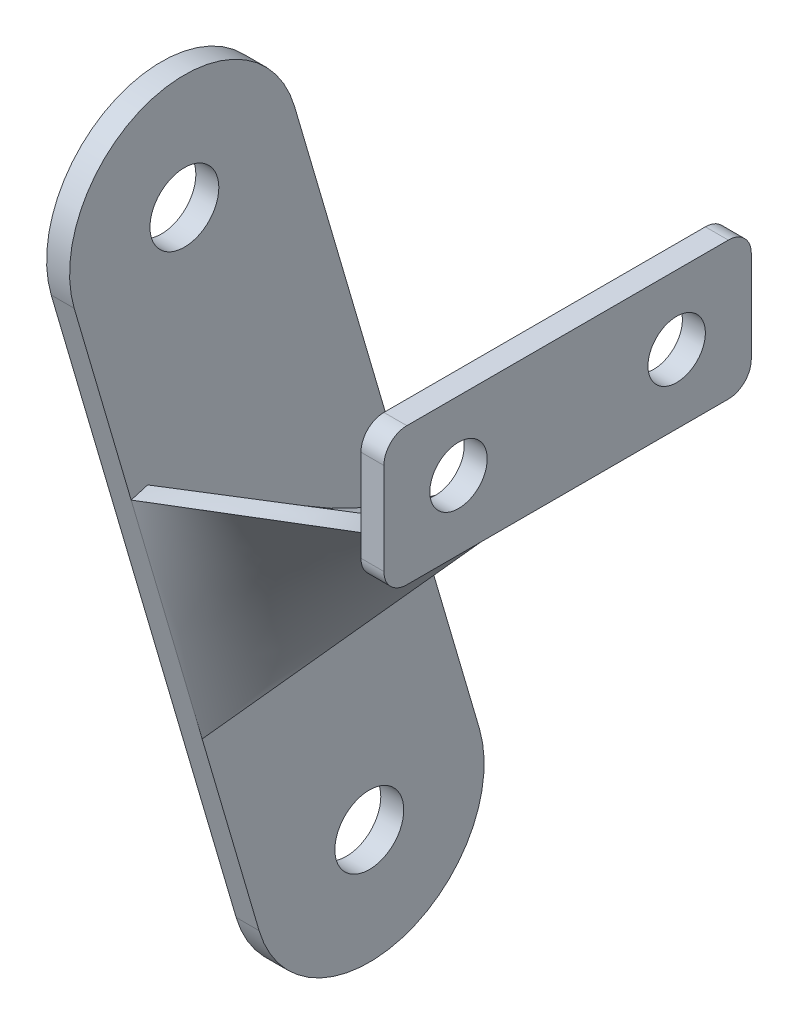
ISO-10303-21;
HEADER;
FILE_DESCRIPTION(('STEP AP214'),'2;1');
FILE_NAME('part.step','',(''),(''),'','','');
FILE_SCHEMA(('AUTOMOTIVE_DESIGN { 1 0 10303 214 1 1 1 1 }'));
ENDSEC;
DATA;
#1=APPLICATION_CONTEXT('core data for automotive mechanical design processes');
#2=APPLICATION_PROTOCOL_DEFINITION('international standard','automotive_design',2000,#1);
#3=PRODUCT_CONTEXT('',#1,'mechanical');
#4=PRODUCT('Part','Part','',(#3));
#5=PRODUCT_RELATED_PRODUCT_CATEGORY('part','',(#4));
#6=PRODUCT_DEFINITION_FORMATION('','',#4);
#7=PRODUCT_DEFINITION_CONTEXT('part definition',#1,'design');
#8=PRODUCT_DEFINITION('design','',#6,#7);
#9=PRODUCT_DEFINITION_SHAPE('','',#8);
#10=(LENGTH_UNIT() NAMED_UNIT(*) SI_UNIT(.MILLI.,.METRE.));
#11=(NAMED_UNIT(*) PLANE_ANGLE_UNIT() SI_UNIT($,.RADIAN.));
#12=(NAMED_UNIT(*) SI_UNIT($,.STERADIAN.) SOLID_ANGLE_UNIT());
#13=UNCERTAINTY_MEASURE_WITH_UNIT(LENGTH_MEASURE(1.E-05),#10,'distance_accuracy_value','');
#14=(GEOMETRIC_REPRESENTATION_CONTEXT(3) GLOBAL_UNCERTAINTY_ASSIGNED_CONTEXT((#13)) GLOBAL_UNIT_ASSIGNED_CONTEXT((#10,
#11,#12)) REPRESENTATION_CONTEXT('',''));
#15=CARTESIAN_POINT('',(0.,0.,0.));
#16=DIRECTION('',(0.,0.,1.));
#17=DIRECTION('',(1.,0.,0.));
#18=AXIS2_PLACEMENT_3D('',#15,#16,#17);
#19=CARTESIAN_POINT('',(-71.4,-55.,-16.1070202085923));
#20=DIRECTION('',(-1.,0.,0.));
#21=DIRECTION('',(0.,0.,-1.));
#22=AXIS2_PLACEMENT_3D('',#19,#20,#21);
#23=PLANE('',#22);
#24=CARTESIAN_POINT('',(-71.4,0.,0.));
#25=DIRECTION('',(1.,0.,0.));
#26=DIRECTION('',(0.,0.,-1.));
#27=AXIS2_PLACEMENT_3D('',#24,#25,#26);
#28=CIRCLE('',#27,3.);
#29=CARTESIAN_POINT('',(-71.4,0.,-3.));
#30=VERTEX_POINT('',#29);
#31=EDGE_CURVE('E233',#30,#30,#28,.T.);
#32=ORIENTED_EDGE('',*,*,#31,.F.);
#33=EDGE_LOOP('',(#32));
#34=FACE_BOUND('',#33,.T.);
#35=CARTESIAN_POINT('',(-71.4,-55.,-16.1070202085923));
#36=DIRECTION('',(1.,0.,0.));
#37=DIRECTION('',(0.,0.,-1.));
#38=AXIS2_PLACEMENT_3D('',#35,#36,#37);
#39=CIRCLE('',#38,3.);
#40=CARTESIAN_POINT('',(-71.4,-55.,-19.1070202085923));
#41=VERTEX_POINT('',#40);
#42=EDGE_CURVE('E223',#41,#41,#39,.T.);
#43=ORIENTED_EDGE('',*,*,#42,.F.);
#44=EDGE_LOOP('',(#43));
#45=FACE_BOUND('',#44,.T.);
#46=DIRECTION('',(0.,0.281050780118523,-0.959692898272551));
#47=VECTOR('',#46,1.);
#48=CARTESIAN_POINT('',(-71.4,-19.5430978350982,3.91520778602865));
#49=LINE('',#48,#47);
#50=CARTESIAN_POINT('',(-71.4,-19.7538859201871,4.63497745973307));
#51=VERTEX_POINT('',#50);
#52=CARTESIAN_POINT('',(-71.4,-19.3323097500093,3.19543811232423));
#53=VERTEX_POINT('',#52);
#54=EDGE_CURVE('E209',#51,#53,#49,.T.);
#55=ORIENTED_EDGE('',*,*,#54,.T.);
#56=DIRECTION('',(0.,-0.959692898272553,-0.281050780118519));
#57=VECTOR('',#56,1.);
#58=CARTESIAN_POINT('',(-71.4,-29.8889316310074,0.103879531020527));
#59=LINE('',#58,#57);
#60=CARTESIAN_POINT('',(-71.4,-40.4455535120055,-2.98767905028318));
#61=VERTEX_POINT('',#60);
#62=EDGE_CURVE('E191',#53,#61,#59,.T.);
#63=ORIENTED_EDGE('',*,*,#62,.T.);
#64=DIRECTION('',(0.,-0.281050780118521,0.959692898272552));
#65=VECTOR('',#64,1.);
#66=CARTESIAN_POINT('',(-71.4,-40.6563415970944,-2.26790937657876));
#67=LINE('',#66,#65);
#68=CARTESIAN_POINT('',(-71.4,-40.8671296821833,-1.54813970287435));
#69=VERTEX_POINT('',#68);
#70=EDGE_CURVE('E199',#61,#69,#67,.T.);
#71=ORIENTED_EDGE('',*,*,#70,.T.);
#72=DIRECTION('',(0.,-0.959692898272552,-0.281050780118519));
#73=VECTOR('',#72,1.);
#74=CARTESIAN_POINT('',(-71.4,-57.8105078011852,-6.51009122586681));
#75=LINE('',#74,#73);
#76=CARTESIAN_POINT('',(-71.4,-57.8105078011852,-6.51009122586681));
#77=VERTEX_POINT('',#76);
#78=EDGE_CURVE('E250',#69,#77,#75,.T.);
#79=ORIENTED_EDGE('',*,*,#78,.T.);
#80=CARTESIAN_POINT('',(-71.4,-55.,-16.1070202085923));
#81=DIRECTION('',(1.,0.,0.));
#82=DIRECTION('',(0.,0.,-1.));
#83=AXIS2_PLACEMENT_3D('',#80,#81,#82);
#84=CIRCLE('',#83,10.);
#85=CARTESIAN_POINT('',(-71.4,-52.1894921988148,-25.7039491913179));
#86=VERTEX_POINT('',#85);
#87=EDGE_CURVE('E240',#77,#86,#84,.T.);
#88=ORIENTED_EDGE('',*,*,#87,.T.);
#89=DIRECTION('',(0.,0.959692898272552,0.281050780118519));
#90=VECTOR('',#89,1.);
#91=CARTESIAN_POINT('',(-71.4,-52.1894921988148,-25.7039491913179));
#92=LINE('',#91,#90);
#93=CARTESIAN_POINT('',(-71.4,2.81050780118519,-9.59692898272552));
#94=VERTEX_POINT('',#93);
#95=EDGE_CURVE('E238',#86,#94,#92,.T.);
#96=ORIENTED_EDGE('',*,*,#95,.T.);
#97=CARTESIAN_POINT('',(-71.4,0.,0.));
#98=DIRECTION('',(1.,0.,0.));
#99=DIRECTION('',(0.,0.,-1.));
#100=AXIS2_PLACEMENT_3D('',#97,#98,#99);
#101=CIRCLE('',#100,10.);
#102=CARTESIAN_POINT('',(-71.4,-2.81050780118519,9.59692898272552));
#103=VERTEX_POINT('',#102);
#104=EDGE_CURVE('E243',#94,#103,#101,.T.);
#105=ORIENTED_EDGE('',*,*,#104,.T.);
#106=EDGE_CURVE('E246',#103,#51,#75,.T.);
#107=ORIENTED_EDGE('',*,*,#106,.T.);
#108=EDGE_LOOP('',(#55,#63,#71,#79,#88,#96,#105,#107));
#109=FACE_BOUND('',#108,.T.);
#110=ADVANCED_FACE('F43',(#34,#45,#109),#23,.F.);
#111=CARTESIAN_POINT('',(-71.4,-55.,-16.1070202085923));
#112=DIRECTION('',(-1.,0.,0.));
#113=DIRECTION('',(0.,0.,-1.));
#114=AXIS2_PLACEMENT_3D('',#111,#112,#113);
#115=CYLINDRICAL_SURFACE('',#114,10.);
#116=CARTESIAN_POINT('',(-73.4,-55.,-16.1070202085923));
#117=DIRECTION('',(1.,0.,0.));
#118=DIRECTION('',(0.,0.,-1.));
#119=AXIS2_PLACEMENT_3D('',#116,#117,#118);
#120=CIRCLE('',#119,10.);
#121=CARTESIAN_POINT('',(-73.4,-57.8105078011852,-6.51009122586681));
#122=VERTEX_POINT('',#121);
#123=CARTESIAN_POINT('',(-73.4,-52.1894921988148,-25.7039491913179));
#124=VERTEX_POINT('',#123);
#125=EDGE_CURVE('E232',#122,#124,#120,.T.);
#126=ORIENTED_EDGE('',*,*,#125,.T.);
#127=DIRECTION('',(-1.,0.,0.));
#128=VECTOR('',#127,1.);
#129=CARTESIAN_POINT('',(-71.4,-52.1894921988148,-25.7039491913179));
#130=LINE('',#129,#128);
#131=EDGE_CURVE('E50',#86,#124,#130,.T.);
#132=ORIENTED_EDGE('',*,*,#131,.F.);
#133=ORIENTED_EDGE('',*,*,#87,.F.);
#134=DIRECTION('',(-1.,0.,0.));
#135=VECTOR('',#134,1.);
#136=CARTESIAN_POINT('',(-71.4,-57.8105078011852,-6.51009122586681));
#137=LINE('',#136,#135);
#138=EDGE_CURVE('E11',#77,#122,#137,.T.);
#139=ORIENTED_EDGE('',*,*,#138,.T.);
#140=EDGE_LOOP('',(#126,#132,#133,#139));
#141=FACE_BOUND('',#140,.T.);
#142=ADVANCED_FACE('F44',(#141),#115,.T.);
#143=CARTESIAN_POINT('',(-71.4,-57.8105078011852,-6.51009122586681));
#144=DIRECTION('',(0.,-0.281050780118519,0.959692898272553));
#145=DIRECTION('',(0.,-0.959692898272553,-0.281050780118519));
#146=AXIS2_PLACEMENT_3D('',#143,#144,#145);
#147=PLANE('',#146);
#148=DIRECTION('',(0.,-0.959692898272552,-0.281050780118519));
#149=VECTOR('',#148,1.);
#150=CARTESIAN_POINT('',(-73.4,-57.8105078011852,-6.51009122586681));
#151=LINE('',#150,#149);
#152=CARTESIAN_POINT('',(-73.4,-2.81050780118519,9.59692898272552));
#153=VERTEX_POINT('',#152);
#154=EDGE_CURVE('E244',#153,#122,#151,.T.);
#155=ORIENTED_EDGE('',*,*,#154,.T.);
#156=ORIENTED_EDGE('',*,*,#138,.F.);
#157=ORIENTED_EDGE('',*,*,#78,.F.);
#158=DIRECTION('',(0.,0.959692898272553,0.281050780118519));
#159=VECTOR('',#158,1.);
#160=CARTESIAN_POINT('',(-71.4,-30.3105078011852,1.54341887842936));
#161=LINE('',#160,#159);
#162=EDGE_CURVE('E204',#69,#51,#161,.T.);
#163=ORIENTED_EDGE('',*,*,#162,.T.);
#164=ORIENTED_EDGE('',*,*,#106,.F.);
#165=DIRECTION('',(-1.,0.,0.));
#166=VECTOR('',#165,1.);
#167=CARTESIAN_POINT('',(-71.4,-2.81050780118519,9.59692898272552));
#168=LINE('',#167,#166);
#169=EDGE_CURVE('E55',#103,#153,#168,.T.);
#170=ORIENTED_EDGE('',*,*,#169,.T.);
#171=EDGE_LOOP('',(#155,#156,#157,#163,#164,#170));
#172=FACE_BOUND('',#171,.T.);
#173=ADVANCED_FACE('F280',(#172),#147,.T.);
#174=CARTESIAN_POINT('',(-71.4,0.,0.));
#175=DIRECTION('',(-1.,0.,0.));
#176=DIRECTION('',(0.,0.,-1.));
#177=AXIS2_PLACEMENT_3D('',#174,#175,#176);
#178=CYLINDRICAL_SURFACE('',#177,10.);
#179=CARTESIAN_POINT('',(-73.4,0.,0.));
#180=DIRECTION('',(1.,0.,0.));
#181=DIRECTION('',(0.,0.,-1.));
#182=AXIS2_PLACEMENT_3D('',#179,#180,#181);
#183=CIRCLE('',#182,10.);
#184=CARTESIAN_POINT('',(-73.4,2.81050780118519,-9.59692898272552));
#185=VERTEX_POINT('',#184);
#186=EDGE_CURVE('E254',#185,#153,#183,.T.);
#187=ORIENTED_EDGE('',*,*,#186,.T.);
#188=ORIENTED_EDGE('',*,*,#169,.F.);
#189=ORIENTED_EDGE('',*,*,#104,.F.);
#190=DIRECTION('',(-1.,0.,0.));
#191=VECTOR('',#190,1.);
#192=CARTESIAN_POINT('',(-71.4,2.81050780118519,-9.59692898272552));
#193=LINE('',#192,#191);
#194=EDGE_CURVE('E259',#94,#185,#193,.T.);
#195=ORIENTED_EDGE('',*,*,#194,.T.);
#196=EDGE_LOOP('',(#187,#188,#189,#195));
#197=FACE_BOUND('',#196,.T.);
#198=ADVANCED_FACE('F273',(#197),#178,.T.);
#199=CARTESIAN_POINT('',(-71.4,-52.1894921988148,-25.7039491913179));
#200=DIRECTION('',(0.,0.281050780118519,-0.959692898272553));
#201=DIRECTION('',(0.,0.959692898272553,0.281050780118519));
#202=AXIS2_PLACEMENT_3D('',#199,#200,#201);
#203=PLANE('',#202);
#204=DIRECTION('',(0.,0.959692898272552,0.281050780118519));
#205=VECTOR('',#204,1.);
#206=CARTESIAN_POINT('',(-73.4,-52.1894921988148,-25.7039491913179));
#207=LINE('',#206,#205);
#208=EDGE_CURVE('E251',#124,#185,#207,.T.);
#209=ORIENTED_EDGE('',*,*,#208,.T.);
#210=ORIENTED_EDGE('',*,*,#194,.F.);
#211=ORIENTED_EDGE('',*,*,#95,.F.);
#212=ORIENTED_EDGE('',*,*,#131,.T.);
#213=EDGE_LOOP('',(#209,#210,#211,#212));
#214=FACE_BOUND('',#213,.T.);
#215=ADVANCED_FACE('F270',(#214),#203,.T.);
#216=CARTESIAN_POINT('',(-73.4,-55.,-16.1070202085923));
#217=DIRECTION('',(-1.,0.,0.));
#218=DIRECTION('',(0.,0.,-1.));
#219=AXIS2_PLACEMENT_3D('',#216,#217,#218);
#220=PLANE('',#219);
#221=CARTESIAN_POINT('',(-73.4,-55.,-16.1070202085923));
#222=DIRECTION('',(1.,0.,0.));
#223=DIRECTION('',(0.,0.,-1.));
#224=AXIS2_PLACEMENT_3D('',#221,#222,#223);
#225=CIRCLE('',#224,3.);
#226=CARTESIAN_POINT('',(-73.4,-55.,-19.1070202085923));
#227=VERTEX_POINT('',#226);
#228=EDGE_CURVE('E198',#227,#227,#225,.T.);
#229=ORIENTED_EDGE('',*,*,#228,.T.);
#230=EDGE_LOOP('',(#229));
#231=FACE_BOUND('',#230,.T.);
#232=CARTESIAN_POINT('',(-73.4,0.,0.));
#233=DIRECTION('',(1.,0.,0.));
#234=DIRECTION('',(0.,0.,-1.));
#235=AXIS2_PLACEMENT_3D('',#232,#233,#234);
#236=CIRCLE('',#235,3.);
#237=CARTESIAN_POINT('',(-73.4,0.,-3.));
#238=VERTEX_POINT('',#237);
#239=EDGE_CURVE('E230',#238,#238,#236,.T.);
#240=ORIENTED_EDGE('',*,*,#239,.T.);
#241=EDGE_LOOP('',(#240));
#242=FACE_BOUND('',#241,.T.);
#243=ORIENTED_EDGE('',*,*,#125,.F.);
#244=ORIENTED_EDGE('',*,*,#154,.F.);
#245=ORIENTED_EDGE('',*,*,#186,.F.);
#246=ORIENTED_EDGE('',*,*,#208,.F.);
#247=EDGE_LOOP('',(#243,#244,#245,#246));
#248=FACE_BOUND('',#247,.T.);
#249=ADVANCED_FACE('F272',(#231,#242,#248),#220,.T.);
#250=CARTESIAN_POINT('',(-71.4,0.,0.));
#251=DIRECTION('',(-1.,0.,0.));
#252=DIRECTION('',(0.,0.,-1.));
#253=AXIS2_PLACEMENT_3D('',#250,#251,#252);
#254=CYLINDRICAL_SURFACE('',#253,3.);
#255=ORIENTED_EDGE('',*,*,#31,.T.);
#256=EDGE_LOOP('',(#255));
#257=FACE_BOUND('',#256,.T.);
#258=ORIENTED_EDGE('',*,*,#239,.F.);
#259=EDGE_LOOP('',(#258));
#260=FACE_BOUND('',#259,.T.);
#261=ADVANCED_FACE('F319',(#257,#260),#254,.F.);
#262=CARTESIAN_POINT('',(-71.4,-55.,-16.1070202085923));
#263=DIRECTION('',(-1.,0.,0.));
#264=DIRECTION('',(0.,0.,-1.));
#265=AXIS2_PLACEMENT_3D('',#262,#263,#264);
#266=CYLINDRICAL_SURFACE('',#265,3.);
#267=ORIENTED_EDGE('',*,*,#42,.T.);
#268=EDGE_LOOP('',(#267));
#269=FACE_BOUND('',#268,.T.);
#270=ORIENTED_EDGE('',*,*,#228,.F.);
#271=EDGE_LOOP('',(#270));
#272=FACE_BOUND('',#271,.T.);
#273=ADVANCED_FACE('F342',(#269,#272),#266,.F.);
#274=CARTESIAN_POINT('',(-71.4,-19.3323097500093,3.19543811232423));
#275=CARTESIAN_POINT('',(-38.7,-1.94999999999999,11.));
#276=CARTESIAN_POINT('',(-71.4,-40.4455535120055,-2.98767905028318));
#277=CARTESIAN_POINT('',(-38.7,-1.94999999999999,-11.));
#278=B_SPLINE_SURFACE_WITH_KNOTS('',1,1,((#274,#275),(#276,#277)),.UNSPECIFIED.,.F.,.F.,.F.,(2,
2),(2,2),(0.,1.),(0.,1.),.UNSPECIFIED.);
#279=DIRECTION('',(0.864020011568549,0.459286344687803,0.206217053592571));
#280=VECTOR('',#279,1.);
#281=CARTESIAN_POINT('',(-55.05,-10.6411548750047,7.09771905616212));
#282=LINE('',#281,#280);
#283=CARTESIAN_POINT('',(-38.7,-1.94999999999999,11.));
#284=VERTEX_POINT('',#283);
#285=EDGE_CURVE('E58',#53,#284,#282,.T.);
#286=DIRECTION('',(0.,0.,-1.));
#287=VECTOR('',#286,1.);
#288=CARTESIAN_POINT('',(-38.7,-1.94999999999999,0.));
#289=LINE('',#288,#287);
#290=CARTESIAN_POINT('',(-38.7,-1.94999999999999,-11.));
#291=VERTEX_POINT('',#290);
#292=EDGE_CURVE('E212',#284,#291,#289,.T.);
#293=DIRECTION('',(0.639409543640034,0.752734688173759,-0.156671390885502));
#294=VECTOR('',#293,1.);
#295=CARTESIAN_POINT('',(-55.05,-21.1977767560027,-6.99383952514159));
#296=LINE('',#295,#294);
#297=EDGE_CURVE('E197',#61,#291,#296,.T.);
#298=ORIENTED_EDGE('',*,*,#62,.F.);
#299=ORIENTED_EDGE('',*,*,#285,.T.);
#300=ORIENTED_EDGE('',*,*,#292,.T.);
#301=ORIENTED_EDGE('',*,*,#297,.F.);
#302=EDGE_LOOP('',(#298,#299,#300,#301));
#303=FACE_BOUND('',#302,.T.);
#304=ADVANCED_FACE('F283',(#303),#278,.F.);
#305=CARTESIAN_POINT('',(-71.4,-40.4455535120055,-2.98767905028318));
#306=CARTESIAN_POINT('',(-38.7,-1.94999999999999,-11.));
#307=CARTESIAN_POINT('',(-71.4,-40.8671296821833,-1.54813970287435));
#308=CARTESIAN_POINT('',(-38.7,-3.44999999999999,-11.));
#309=B_SPLINE_SURFACE_WITH_KNOTS('',1,1,((#305,#306),(#307,#308)),.UNSPECIFIED.,.F.,.F.,.F.,(2,
2),(2,2),(0.,1.),(0.,1.),.UNSPECIFIED.);
#310=DIRECTION('',(0.,-1.,0.));
#311=VECTOR('',#310,1.);
#312=CARTESIAN_POINT('',(-38.7,-2.69999999999999,-11.));
#313=LINE('',#312,#311);
#314=CARTESIAN_POINT('',(-38.7,-3.44999999999999,-11.));
#315=VERTEX_POINT('',#314);
#316=EDGE_CURVE('E220',#291,#315,#313,.T.);
#317=DIRECTION('',(0.646458540191,0.739713242583533,-0.186857364213123));
#318=VECTOR('',#317,1.);
#319=CARTESIAN_POINT('',(-55.05,-22.1585648410916,-6.27406985143717));
#320=LINE('',#319,#318);
#321=EDGE_CURVE('E66',#69,#315,#320,.T.);
#322=ORIENTED_EDGE('',*,*,#70,.F.);
#323=ORIENTED_EDGE('',*,*,#297,.T.);
#324=ORIENTED_EDGE('',*,*,#316,.T.);
#325=ORIENTED_EDGE('',*,*,#321,.F.);
#326=EDGE_LOOP('',(#322,#323,#324,#325));
#327=FACE_BOUND('',#326,.T.);
#328=ADVANCED_FACE('F284',(#327),#309,.F.);
#329=CARTESIAN_POINT('',(-71.4,-40.8671296821833,-1.54813970287435));
#330=CARTESIAN_POINT('',(-38.7,-3.44999999999999,-11.));
#331=CARTESIAN_POINT('',(-71.4,-19.7538859201871,4.63497745973306));
#332=CARTESIAN_POINT('',(-38.7,-3.44999999999999,11.));
#333=B_SPLINE_SURFACE_WITH_KNOTS('',1,1,((#329,#330),(#331,#332)),.UNSPECIFIED.,.F.,.F.,.F.,(2,
2),(2,2),(0.,1.),(0.,1.),.UNSPECIFIED.);
#334=DIRECTION('',(0.,0.,1.));
#335=VECTOR('',#334,1.);
#336=CARTESIAN_POINT('',(-38.7,-3.44999999999999,0.));
#337=LINE('',#336,#335);
#338=CARTESIAN_POINT('',(-38.7,-3.44999999999999,11.));
#339=VERTEX_POINT('',#338);
#340=EDGE_CURVE('E218',#315,#339,#337,.T.);
#341=DIRECTION('',(0.881654602784452,0.439583977516991,0.171613193255448));
#342=VECTOR('',#341,1.);
#343=CARTESIAN_POINT('',(-55.05,-11.6019429600936,7.81748872986653));
#344=LINE('',#343,#342);
#345=EDGE_CURVE('E210',#51,#339,#344,.T.);
#346=ORIENTED_EDGE('',*,*,#162,.F.);
#347=ORIENTED_EDGE('',*,*,#321,.T.);
#348=ORIENTED_EDGE('',*,*,#340,.T.);
#349=ORIENTED_EDGE('',*,*,#345,.F.);
#350=EDGE_LOOP('',(#346,#347,#348,#349));
#351=FACE_BOUND('',#350,.T.);
#352=ADVANCED_FACE('F296',(#351),#333,.F.);
#353=CARTESIAN_POINT('',(-71.4,-19.7538859201871,4.63497745973306));
#354=CARTESIAN_POINT('',(-38.7,-3.44999999999999,11.));
#355=CARTESIAN_POINT('',(-71.4,-19.3323097500093,3.19543811232423));
#356=CARTESIAN_POINT('',(-38.7,-1.94999999999999,11.));
#357=B_SPLINE_SURFACE_WITH_KNOTS('',1,1,((#353,#354),(#355,#356)),.UNSPECIFIED.,.F.,.F.,.F.,(2,
2),(2,2),(0.,1.),(0.,1.),.UNSPECIFIED.);
#358=DIRECTION('',(0.,1.,0.));
#359=VECTOR('',#358,1.);
#360=CARTESIAN_POINT('',(-38.7,-2.69999999999999,11.));
#361=LINE('',#360,#359);
#362=EDGE_CURVE('E225',#339,#284,#361,.T.);
#363=ORIENTED_EDGE('',*,*,#54,.F.);
#364=ORIENTED_EDGE('',*,*,#345,.T.);
#365=ORIENTED_EDGE('',*,*,#362,.T.);
#366=ORIENTED_EDGE('',*,*,#285,.F.);
#367=EDGE_LOOP('',(#363,#364,#365,#366));
#368=FACE_BOUND('',#367,.T.);
#369=ADVANCED_FACE('F300',(#368),#357,.F.);
#370=CARTESIAN_POINT('',(-36.7,-1.44999999999999,-12.6770202085923));
#371=DIRECTION('',(-1.,0.,0.));
#372=DIRECTION('',(0.,0.,-1.));
#373=AXIS2_PLACEMENT_3D('',#370,#371,#372);
#374=CYLINDRICAL_SURFACE('',#373,2.);
#375=CARTESIAN_POINT('',(-38.7,-1.44999999999999,-12.6770202085923));
#376=DIRECTION('',(1.,0.,0.));
#377=DIRECTION('',(0.,0.,-1.));
#378=AXIS2_PLACEMENT_3D('',#375,#376,#377);
#379=CIRCLE('',#378,2.);
#380=CARTESIAN_POINT('',(-38.7,-3.44999999999999,-12.6770202085923));
#381=VERTEX_POINT('',#380);
#382=CARTESIAN_POINT('',(-38.7,-1.44999999999999,-14.6770202085923));
#383=VERTEX_POINT('',#382);
#384=EDGE_CURVE('E183',#381,#383,#379,.T.);
#385=ORIENTED_EDGE('',*,*,#384,.T.);
#386=DIRECTION('',(-1.,0.,0.));
#387=VECTOR('',#386,1.);
#388=CARTESIAN_POINT('',(-36.7,-1.44999999999999,-14.6770202085923));
#389=LINE('',#388,#387);
#390=CARTESIAN_POINT('',(-36.7,-1.44999999999999,-14.6770202085923));
#391=VERTEX_POINT('',#390);
#392=EDGE_CURVE('E164',#391,#383,#389,.T.);
#393=ORIENTED_EDGE('',*,*,#392,.F.);
#394=CARTESIAN_POINT('',(-36.7,-1.44999999999999,-12.6770202085923));
#395=DIRECTION('',(1.,0.,0.));
#396=DIRECTION('',(0.,0.,-1.));
#397=AXIS2_PLACEMENT_3D('',#394,#395,#396);
#398=CIRCLE('',#397,2.);
#399=CARTESIAN_POINT('',(-36.7,-3.44999999999999,-12.6770202085923));
#400=VERTEX_POINT('',#399);
#401=EDGE_CURVE('E171',#400,#391,#398,.T.);
#402=ORIENTED_EDGE('',*,*,#401,.F.);
#403=DIRECTION('',(-1.,0.,0.));
#404=VECTOR('',#403,1.);
#405=CARTESIAN_POINT('',(-36.7,-3.44999999999999,-12.6770202085923));
#406=LINE('',#405,#404);
#407=EDGE_CURVE('E221',#400,#381,#406,.T.);
#408=ORIENTED_EDGE('',*,*,#407,.T.);
#409=EDGE_LOOP('',(#385,#393,#402,#408));
#410=FACE_BOUND('',#409,.T.);
#411=ADVANCED_FACE('F181',(#410),#374,.T.);
#412=CARTESIAN_POINT('',(-36.7,-3.44999999999999,15.3229797914077));
#413=DIRECTION('',(0.,-1.,0.));
#414=DIRECTION('',(0.,0.,-1.));
#415=AXIS2_PLACEMENT_3D('',#412,#413,#414);
#416=PLANE('',#415);
#417=DIRECTION('',(0.,0.,-1.));
#418=VECTOR('',#417,1.);
#419=CARTESIAN_POINT('',(-38.7,-3.44999999999999,15.3229797914077));
#420=LINE('',#419,#418);
#421=CARTESIAN_POINT('',(-38.7,-3.44999999999999,15.3229797914077));
#422=VERTEX_POINT('',#421);
#423=EDGE_CURVE('E182',#422,#339,#420,.T.);
#424=ORIENTED_EDGE('',*,*,#423,.T.);
#425=ORIENTED_EDGE('',*,*,#340,.F.);
#426=EDGE_CURVE('E287',#315,#381,#420,.T.);
#427=ORIENTED_EDGE('',*,*,#426,.T.);
#428=ORIENTED_EDGE('',*,*,#407,.F.);
#429=DIRECTION('',(0.,0.,-1.));
#430=VECTOR('',#429,1.);
#431=CARTESIAN_POINT('',(-36.7,-3.44999999999999,15.3229797914077));
#432=LINE('',#431,#430);
#433=CARTESIAN_POINT('',(-36.7,-3.44999999999999,15.3229797914077));
#434=VERTEX_POINT('',#433);
#435=EDGE_CURVE('E180',#434,#400,#432,.T.);
#436=ORIENTED_EDGE('',*,*,#435,.F.);
#437=DIRECTION('',(-1.,0.,0.));
#438=VECTOR('',#437,1.);
#439=CARTESIAN_POINT('',(-36.7,-3.44999999999999,15.3229797914077));
#440=LINE('',#439,#438);
#441=EDGE_CURVE('E550',#434,#422,#440,.T.);
#442=ORIENTED_EDGE('',*,*,#441,.T.);
#443=EDGE_LOOP('',(#424,#425,#427,#428,#436,#442));
#444=FACE_BOUND('',#443,.T.);
#445=ADVANCED_FACE('F294',(#444),#416,.T.);
#446=CARTESIAN_POINT('',(-36.7,-1.44999999999999,15.3229797914077));
#447=DIRECTION('',(-1.,0.,0.));
#448=DIRECTION('',(0.,0.,-1.));
#449=AXIS2_PLACEMENT_3D('',#446,#447,#448);
#450=CYLINDRICAL_SURFACE('',#449,2.);
#451=CARTESIAN_POINT('',(-38.7,-1.44999999999999,15.3229797914077));
#452=DIRECTION('',(1.,0.,0.));
#453=DIRECTION('',(0.,0.,-1.));
#454=AXIS2_PLACEMENT_3D('',#451,#452,#453);
#455=CIRCLE('',#454,2.);
#456=CARTESIAN_POINT('',(-38.7,-1.44999999999999,17.3229797914077));
#457=VERTEX_POINT('',#456);
#458=EDGE_CURVE('E295',#457,#422,#455,.T.);
#459=ORIENTED_EDGE('',*,*,#458,.T.);
#460=ORIENTED_EDGE('',*,*,#441,.F.);
#461=CARTESIAN_POINT('',(-36.7,-1.44999999999999,15.3229797914077));
#462=DIRECTION('',(1.,0.,0.));
#463=DIRECTION('',(0.,0.,-1.));
#464=AXIS2_PLACEMENT_3D('',#461,#462,#463);
#465=CIRCLE('',#464,2.);
#466=CARTESIAN_POINT('',(-36.7,-1.44999999999999,17.3229797914077));
#467=VERTEX_POINT('',#466);
#468=EDGE_CURVE('E188',#467,#434,#465,.T.);
#469=ORIENTED_EDGE('',*,*,#468,.F.);
#470=DIRECTION('',(-1.,0.,0.));
#471=VECTOR('',#470,1.);
#472=CARTESIAN_POINT('',(-36.7,-1.44999999999999,17.3229797914077));
#473=LINE('',#472,#471);
#474=EDGE_CURVE('E548',#467,#457,#473,.T.);
#475=ORIENTED_EDGE('',*,*,#474,.T.);
#476=EDGE_LOOP('',(#459,#460,#469,#475));
#477=FACE_BOUND('',#476,.T.);
#478=ADVANCED_FACE('F391',(#477),#450,.T.);
#479=CARTESIAN_POINT('',(-36.7,-1.44999999999999,17.3229797914077));
#480=DIRECTION('',(0.,0.,1.));
#481=DIRECTION('',(-1.,0.,0.));
#482=AXIS2_PLACEMENT_3D('',#479,#480,#481);
#483=PLANE('',#482);
#484=DIRECTION('',(0.,-1.,0.));
#485=VECTOR('',#484,1.);
#486=CARTESIAN_POINT('',(-38.7,-1.44999999999999,17.3229797914077));
#487=LINE('',#486,#485);
#488=CARTESIAN_POINT('',(-38.7,6.54999999999999,17.3229797914077));
#489=VERTEX_POINT('',#488);
#490=EDGE_CURVE('E543',#489,#457,#487,.T.);
#491=ORIENTED_EDGE('',*,*,#490,.T.);
#492=ORIENTED_EDGE('',*,*,#474,.F.);
#493=DIRECTION('',(0.,-1.,0.));
#494=VECTOR('',#493,1.);
#495=CARTESIAN_POINT('',(-36.7,-1.44999999999999,17.3229797914077));
#496=LINE('',#495,#494);
#497=CARTESIAN_POINT('',(-36.7,6.54999999999999,17.3229797914077));
#498=VERTEX_POINT('',#497);
#499=EDGE_CURVE('E533',#498,#467,#496,.T.);
#500=ORIENTED_EDGE('',*,*,#499,.F.);
#501=DIRECTION('',(-1.,0.,0.));
#502=VECTOR('',#501,1.);
#503=CARTESIAN_POINT('',(-36.7,6.54999999999999,17.3229797914077));
#504=LINE('',#503,#502);
#505=EDGE_CURVE('E555',#498,#489,#504,.T.);
#506=ORIENTED_EDGE('',*,*,#505,.T.);
#507=EDGE_LOOP('',(#491,#492,#500,#506));
#508=FACE_BOUND('',#507,.T.);
#509=ADVANCED_FACE('F405',(#508),#483,.T.);
#510=CARTESIAN_POINT('',(-36.7,6.54999999999999,15.3229797914077));
#511=DIRECTION('',(-1.,0.,0.));
#512=DIRECTION('',(0.,0.,-1.));
#513=AXIS2_PLACEMENT_3D('',#510,#511,#512);
#514=CYLINDRICAL_SURFACE('',#513,2.);
#515=CARTESIAN_POINT('',(-38.7,6.54999999999999,15.3229797914077));
#516=DIRECTION('',(1.,0.,0.));
#517=DIRECTION('',(0.,0.,1.));
#518=AXIS2_PLACEMENT_3D('',#515,#516,#517);
#519=CIRCLE('',#518,2.);
#520=CARTESIAN_POINT('',(-38.7,8.54999999999999,15.3229797914077));
#521=VERTEX_POINT('',#520);
#522=EDGE_CURVE('E541',#521,#489,#519,.T.);
#523=ORIENTED_EDGE('',*,*,#522,.T.);
#524=ORIENTED_EDGE('',*,*,#505,.F.);
#525=CARTESIAN_POINT('',(-36.7,6.54999999999999,15.3229797914077));
#526=DIRECTION('',(1.,0.,0.));
#527=DIRECTION('',(0.,0.,1.));
#528=AXIS2_PLACEMENT_3D('',#525,#526,#527);
#529=CIRCLE('',#528,2.);
#530=CARTESIAN_POINT('',(-36.7,8.54999999999999,15.3229797914077));
#531=VERTEX_POINT('',#530);
#532=EDGE_CURVE('E530',#531,#498,#529,.T.);
#533=ORIENTED_EDGE('',*,*,#532,.F.);
#534=DIRECTION('',(-1.,0.,0.));
#535=VECTOR('',#534,1.);
#536=CARTESIAN_POINT('',(-36.7,8.54999999999999,15.3229797914077));
#537=LINE('',#536,#535);
#538=EDGE_CURVE('E553',#531,#521,#537,.T.);
#539=ORIENTED_EDGE('',*,*,#538,.T.);
#540=EDGE_LOOP('',(#523,#524,#533,#539));
#541=FACE_BOUND('',#540,.T.);
#542=ADVANCED_FACE('F415',(#541),#514,.T.);
#543=CARTESIAN_POINT('',(-36.7,8.54999999999999,15.3229797914077));
#544=DIRECTION('',(0.,1.,0.));
#545=DIRECTION('',(0.,0.,1.));
#546=AXIS2_PLACEMENT_3D('',#543,#544,#545);
#547=PLANE('',#546);
#548=DIRECTION('',(0.,0.,1.));
#549=VECTOR('',#548,1.);
#550=CARTESIAN_POINT('',(-38.7,8.54999999999999,15.3229797914077));
#551=LINE('',#550,#549);
#552=CARTESIAN_POINT('',(-38.7,8.55,-12.6770202085923));
#553=VERTEX_POINT('',#552);
#554=EDGE_CURVE('E537',#553,#521,#551,.T.);
#555=ORIENTED_EDGE('',*,*,#554,.T.);
#556=ORIENTED_EDGE('',*,*,#538,.F.);
#557=DIRECTION('',(0.,0.,1.));
#558=VECTOR('',#557,1.);
#559=CARTESIAN_POINT('',(-36.7,8.54999999999999,15.3229797914077));
#560=LINE('',#559,#558);
#561=CARTESIAN_POINT('',(-36.7,8.55,-12.6770202085923));
#562=VERTEX_POINT('',#561);
#563=EDGE_CURVE('E527',#562,#531,#560,.T.);
#564=ORIENTED_EDGE('',*,*,#563,.F.);
#565=DIRECTION('',(-1.,0.,0.));
#566=VECTOR('',#565,1.);
#567=CARTESIAN_POINT('',(-36.7,8.55,-12.6770202085923));
#568=LINE('',#567,#566);
#569=EDGE_CURVE('E186',#562,#553,#568,.T.);
#570=ORIENTED_EDGE('',*,*,#569,.T.);
#571=EDGE_LOOP('',(#555,#556,#564,#570));
#572=FACE_BOUND('',#571,.T.);
#573=ADVANCED_FACE('F425',(#572),#547,.T.);
#574=CARTESIAN_POINT('',(-36.7,6.54999999999999,-12.6770202085923));
#575=DIRECTION('',(-1.,0.,0.));
#576=DIRECTION('',(0.,0.,-1.));
#577=AXIS2_PLACEMENT_3D('',#574,#575,#576);
#578=CYLINDRICAL_SURFACE('',#577,2.);
#579=CARTESIAN_POINT('',(-38.7,6.54999999999999,-12.6770202085923));
#580=DIRECTION('',(1.,0.,0.));
#581=DIRECTION('',(0.,0.,-1.));
#582=AXIS2_PLACEMENT_3D('',#579,#580,#581);
#583=CIRCLE('',#582,2.);
#584=CARTESIAN_POINT('',(-38.7,6.54999999999999,-14.6770202085923));
#585=VERTEX_POINT('',#584);
#586=EDGE_CURVE('E540',#585,#553,#583,.T.);
#587=ORIENTED_EDGE('',*,*,#586,.T.);
#588=ORIENTED_EDGE('',*,*,#569,.F.);
#589=CARTESIAN_POINT('',(-36.7,6.54999999999999,-12.6770202085923));
#590=DIRECTION('',(1.,0.,0.));
#591=DIRECTION('',(0.,0.,-1.));
#592=AXIS2_PLACEMENT_3D('',#589,#590,#591);
#593=CIRCLE('',#592,2.);
#594=CARTESIAN_POINT('',(-36.7,6.54999999999999,-14.6770202085923));
#595=VERTEX_POINT('',#594);
#596=EDGE_CURVE('E174',#595,#562,#593,.T.);
#597=ORIENTED_EDGE('',*,*,#596,.F.);
#598=DIRECTION('',(-1.,0.,0.));
#599=VECTOR('',#598,1.);
#600=CARTESIAN_POINT('',(-36.7,6.54999999999999,-14.6770202085923));
#601=LINE('',#600,#599);
#602=EDGE_CURVE('E169',#595,#585,#601,.T.);
#603=ORIENTED_EDGE('',*,*,#602,.T.);
#604=EDGE_LOOP('',(#587,#588,#597,#603));
#605=FACE_BOUND('',#604,.T.);
#606=ADVANCED_FACE('F435',(#605),#578,.T.);
#607=CARTESIAN_POINT('',(-36.7,-1.44999999999999,-14.6770202085923));
#608=DIRECTION('',(0.,0.,-1.));
#609=DIRECTION('',(1.,0.,0.));
#610=AXIS2_PLACEMENT_3D('',#607,#608,#609);
#611=PLANE('',#610);
#612=DIRECTION('',(0.,1.,0.));
#613=VECTOR('',#612,1.);
#614=CARTESIAN_POINT('',(-38.7,-1.44999999999999,-14.6770202085923));
#615=LINE('',#614,#613);
#616=EDGE_CURVE('E532',#383,#585,#615,.T.);
#617=ORIENTED_EDGE('',*,*,#616,.T.);
#618=ORIENTED_EDGE('',*,*,#602,.F.);
#619=DIRECTION('',(0.,1.,0.));
#620=VECTOR('',#619,1.);
#621=CARTESIAN_POINT('',(-36.7,-1.44999999999999,-14.6770202085923));
#622=LINE('',#621,#620);
#623=EDGE_CURVE('E161',#391,#595,#622,.T.);
#624=ORIENTED_EDGE('',*,*,#623,.F.);
#625=ORIENTED_EDGE('',*,*,#392,.T.);
#626=EDGE_LOOP('',(#617,#618,#624,#625));
#627=FACE_BOUND('',#626,.T.);
#628=ADVANCED_FACE('F162',(#627),#611,.T.);
#629=CARTESIAN_POINT('',(-36.7,-1.44999999999999,-12.6770202085923));
#630=DIRECTION('',(-1.,0.,0.));
#631=DIRECTION('',(0.,0.,-1.));
#632=AXIS2_PLACEMENT_3D('',#629,#630,#631);
#633=PLANE('',#632);
#634=CARTESIAN_POINT('',(-36.7,2.55,-8.17702020859233));
#635=DIRECTION('',(1.,0.,0.));
#636=DIRECTION('',(0.,0.,1.));
#637=AXIS2_PLACEMENT_3D('',#634,#635,#636);
#638=CIRCLE('',#637,2.5);
#639=CARTESIAN_POINT('',(-36.7,2.55,-5.67702020859233));
#640=VERTEX_POINT('',#639);
#641=EDGE_CURVE('E511',#640,#640,#638,.T.);
#642=ORIENTED_EDGE('',*,*,#641,.F.);
#643=EDGE_LOOP('',(#642));
#644=FACE_BOUND('',#643,.T.);
#645=CARTESIAN_POINT('',(-36.7,2.55,10.8229797914077));
#646=DIRECTION('',(1.,0.,0.));
#647=DIRECTION('',(0.,0.,-1.));
#648=AXIS2_PLACEMENT_3D('',#645,#646,#647);
#649=CIRCLE('',#648,2.5);
#650=CARTESIAN_POINT('',(-36.7,2.55,8.32297979140767));
#651=VERTEX_POINT('',#650);
#652=EDGE_CURVE('E523',#651,#651,#649,.T.);
#653=ORIENTED_EDGE('',*,*,#652,.F.);
#654=EDGE_LOOP('',(#653));
#655=FACE_BOUND('',#654,.T.);
#656=ORIENTED_EDGE('',*,*,#401,.T.);
#657=ORIENTED_EDGE('',*,*,#623,.T.);
#658=ORIENTED_EDGE('',*,*,#596,.T.);
#659=ORIENTED_EDGE('',*,*,#563,.T.);
#660=ORIENTED_EDGE('',*,*,#532,.T.);
#661=ORIENTED_EDGE('',*,*,#499,.T.);
#662=ORIENTED_EDGE('',*,*,#468,.T.);
#663=ORIENTED_EDGE('',*,*,#435,.T.);
#664=EDGE_LOOP('',(#656,#657,#658,#659,#660,#661,#662,#663));
#665=FACE_BOUND('',#664,.T.);
#666=ADVANCED_FACE('F172',(#644,#655,#665),#633,.F.);
#667=CARTESIAN_POINT('',(-38.7,-1.44999999999999,-12.6770202085923));
#668=DIRECTION('',(-1.,0.,0.));
#669=DIRECTION('',(0.,0.,-1.));
#670=AXIS2_PLACEMENT_3D('',#667,#668,#669);
#671=PLANE('',#670);
#672=CARTESIAN_POINT('',(-38.7,2.55,-8.17702020859233));
#673=DIRECTION('',(1.,0.,0.));
#674=DIRECTION('',(0.,0.,1.));
#675=AXIS2_PLACEMENT_3D('',#672,#673,#674);
#676=CIRCLE('',#675,2.5);
#677=CARTESIAN_POINT('',(-38.7,2.55,-5.67702020859233));
#678=VERTEX_POINT('',#677);
#679=EDGE_CURVE('E519',#678,#678,#676,.T.);
#680=ORIENTED_EDGE('',*,*,#679,.T.);
#681=EDGE_LOOP('',(#680));
#682=FACE_BOUND('',#681,.T.);
#683=CARTESIAN_POINT('',(-38.7,2.55,10.8229797914077));
#684=DIRECTION('',(1.,0.,0.));
#685=DIRECTION('',(0.,0.,-1.));
#686=AXIS2_PLACEMENT_3D('',#683,#684,#685);
#687=CIRCLE('',#686,2.5);
#688=CARTESIAN_POINT('',(-38.7,2.55,8.32297979140767));
#689=VERTEX_POINT('',#688);
#690=EDGE_CURVE('E520',#689,#689,#687,.T.);
#691=ORIENTED_EDGE('',*,*,#690,.T.);
#692=EDGE_LOOP('',(#691));
#693=FACE_BOUND('',#692,.T.);
#694=ORIENTED_EDGE('',*,*,#292,.F.);
#695=ORIENTED_EDGE('',*,*,#362,.F.);
#696=ORIENTED_EDGE('',*,*,#423,.F.);
#697=ORIENTED_EDGE('',*,*,#458,.F.);
#698=ORIENTED_EDGE('',*,*,#490,.F.);
#699=ORIENTED_EDGE('',*,*,#522,.F.);
#700=ORIENTED_EDGE('',*,*,#554,.F.);
#701=ORIENTED_EDGE('',*,*,#586,.F.);
#702=ORIENTED_EDGE('',*,*,#616,.F.);
#703=ORIENTED_EDGE('',*,*,#384,.F.);
#704=ORIENTED_EDGE('',*,*,#426,.F.);
#705=ORIENTED_EDGE('',*,*,#316,.F.);
#706=EDGE_LOOP('',(#694,#695,#696,#697,#698,#699,#700,#701,#702,#703,#704,#705));
#707=FACE_BOUND('',#706,.T.);
#708=ADVANCED_FACE('F290',(#682,#693,#707),#671,.T.);
#709=CARTESIAN_POINT('',(-36.7,2.55,10.8229797914077));
#710=DIRECTION('',(-1.,0.,0.));
#711=DIRECTION('',(0.,0.,-1.));
#712=AXIS2_PLACEMENT_3D('',#709,#710,#711);
#713=CYLINDRICAL_SURFACE('',#712,2.5);
#714=ORIENTED_EDGE('',*,*,#652,.T.);
#715=EDGE_LOOP('',(#714));
#716=FACE_BOUND('',#715,.T.);
#717=ORIENTED_EDGE('',*,*,#690,.F.);
#718=EDGE_LOOP('',(#717));
#719=FACE_BOUND('',#718,.T.);
#720=ADVANCED_FACE('F470',(#716,#719),#713,.F.);
#721=CARTESIAN_POINT('',(-36.7,2.55,-8.17702020859233));
#722=DIRECTION('',(-1.,0.,0.));
#723=DIRECTION('',(0.,0.,-1.));
#724=AXIS2_PLACEMENT_3D('',#721,#722,#723);
#725=CYLINDRICAL_SURFACE('',#724,2.5);
#726=ORIENTED_EDGE('',*,*,#641,.T.);
#727=EDGE_LOOP('',(#726));
#728=FACE_BOUND('',#727,.T.);
#729=ORIENTED_EDGE('',*,*,#679,.F.);
#730=EDGE_LOOP('',(#729));
#731=FACE_BOUND('',#730,.T.);
#732=ADVANCED_FACE('F478',(#728,#731),#725,.F.);
#733=CLOSED_SHELL('',(#110,#142,#173,#198,#215,#249,#261,#273,#304,#328,#352,#369,#411,#445,
#478,#509,#542,#573,#606,#628,#666,#708,#720,#732));
#734=MANIFOLD_SOLID_BREP('B2',#733);
#735=ADVANCED_BREP_SHAPE_REPRESENTATION('',(#18,#734),#14);
#736=SHAPE_DEFINITION_REPRESENTATION(#9,#735);
ENDSEC;
END-ISO-10303-21;
